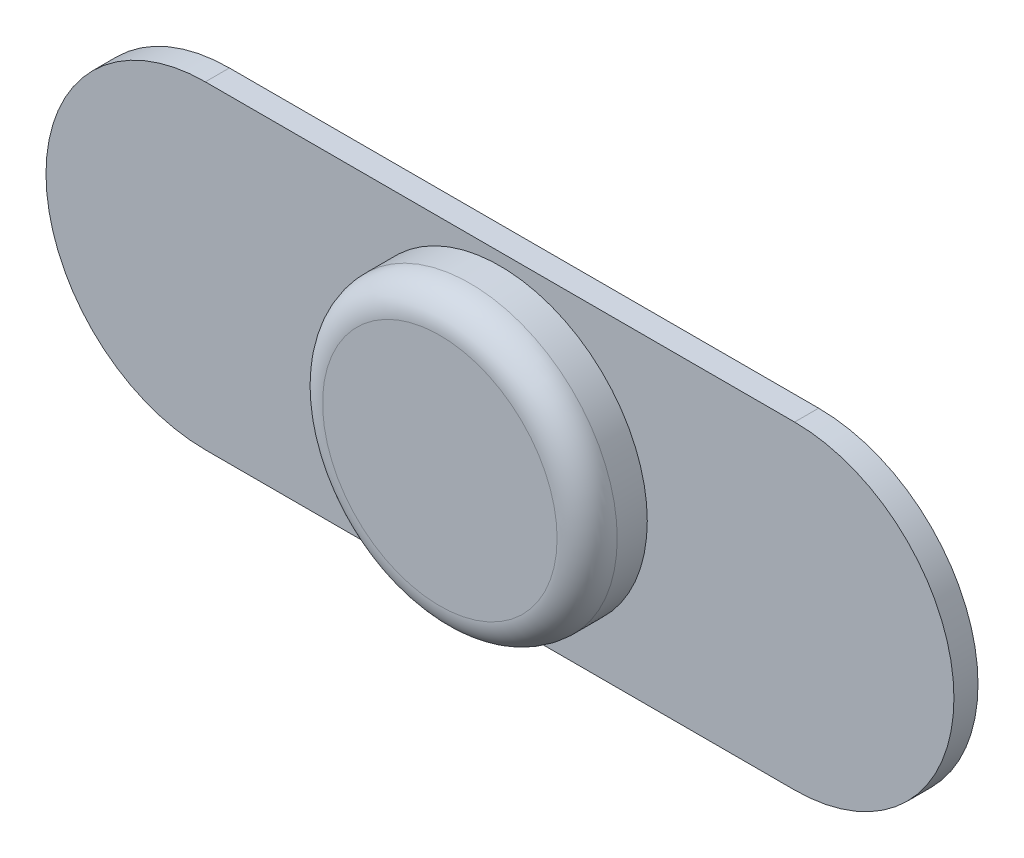
ISO-10303-21;
HEADER;
FILE_DESCRIPTION(('STEP AP214'),'2;1');
FILE_NAME('part.step','',(''),(''),'','','');
FILE_SCHEMA(('AUTOMOTIVE_DESIGN { 1 0 10303 214 1 1 1 1 }'));
ENDSEC;
DATA;
#1=APPLICATION_CONTEXT('core data for automotive mechanical design processes');
#2=APPLICATION_PROTOCOL_DEFINITION('international standard','automotive_design',2000,#1);
#3=PRODUCT_CONTEXT('',#1,'mechanical');
#4=PRODUCT('Part','Part','',(#3));
#5=PRODUCT_RELATED_PRODUCT_CATEGORY('part','',(#4));
#6=PRODUCT_DEFINITION_FORMATION('','',#4);
#7=PRODUCT_DEFINITION_CONTEXT('part definition',#1,'design');
#8=PRODUCT_DEFINITION('design','',#6,#7);
#9=PRODUCT_DEFINITION_SHAPE('','',#8);
#10=(LENGTH_UNIT() NAMED_UNIT(*) SI_UNIT(.MILLI.,.METRE.));
#11=(NAMED_UNIT(*) PLANE_ANGLE_UNIT() SI_UNIT($,.RADIAN.));
#12=(NAMED_UNIT(*) SI_UNIT($,.STERADIAN.) SOLID_ANGLE_UNIT());
#13=UNCERTAINTY_MEASURE_WITH_UNIT(LENGTH_MEASURE(1.E-05),#10,'distance_accuracy_value','');
#14=(GEOMETRIC_REPRESENTATION_CONTEXT(3) GLOBAL_UNCERTAINTY_ASSIGNED_CONTEXT((#13)) GLOBAL_UNIT_ASSIGNED_CONTEXT((#10,
#11,#12)) REPRESENTATION_CONTEXT('',''));
#15=CARTESIAN_POINT('',(0.,0.,0.));
#16=DIRECTION('',(0.,0.,1.));
#17=DIRECTION('',(1.,0.,0.));
#18=AXIS2_PLACEMENT_3D('',#15,#16,#17);
#19=CARTESIAN_POINT('',(0.,0.,1.));
#20=DIRECTION('',(0.,0.,-1.));
#21=DIRECTION('',(-1.,0.,0.));
#22=AXIS2_PLACEMENT_3D('',#19,#20,#21);
#23=CYLINDRICAL_SURFACE('',#22,2.45);
#24=CARTESIAN_POINT('',(0.,0.,0.5));
#25=DIRECTION('',(0.,0.,1.));
#26=DIRECTION('',(1.,0.,0.));
#27=AXIS2_PLACEMENT_3D('',#24,#25,#26);
#28=CIRCLE('',#27,2.45);
#29=CARTESIAN_POINT('',(2.45,0.,0.5));
#30=VERTEX_POINT('',#29);
#31=EDGE_CURVE('E11',#30,#30,#28,.F.);
#32=ORIENTED_EDGE('',*,*,#31,.T.);
#33=EDGE_LOOP('',(#32));
#34=FACE_BOUND('',#33,.T.);
#35=CARTESIAN_POINT('',(0.,0.,0.));
#36=DIRECTION('',(0.,0.,1.));
#37=DIRECTION('',(1.,0.,0.));
#38=AXIS2_PLACEMENT_3D('',#35,#36,#37);
#39=CIRCLE('',#38,2.45);
#40=CARTESIAN_POINT('',(2.45,0.,0.));
#41=VERTEX_POINT('',#40);
#42=EDGE_CURVE('E116',#41,#41,#39,.T.);
#43=ORIENTED_EDGE('',*,*,#42,.T.);
#44=EDGE_LOOP('',(#43));
#45=FACE_BOUND('',#44,.T.);
#46=ADVANCED_FACE('F39',(#34,#45),#23,.T.);
#47=CARTESIAN_POINT('',(0.,0.,1.));
#48=DIRECTION('',(0.,0.,1.));
#49=DIRECTION('',(1.,0.,0.));
#50=AXIS2_PLACEMENT_3D('',#47,#48,#49);
#51=PLANE('',#50);
#52=CARTESIAN_POINT('',(0.,0.,1.));
#53=DIRECTION('',(0.,0.,1.));
#54=DIRECTION('',(1.,0.,0.));
#55=AXIS2_PLACEMENT_3D('',#52,#53,#54);
#56=CIRCLE('',#55,1.95);
#57=CARTESIAN_POINT('',(1.95,0.,1.));
#58=VERTEX_POINT('',#57);
#59=EDGE_CURVE('E48',#58,#58,#56,.T.);
#60=ORIENTED_EDGE('',*,*,#59,.T.);
#61=EDGE_LOOP('',(#60));
#62=FACE_BOUND('',#61,.T.);
#63=ADVANCED_FACE('F121',(#62),#51,.T.);
#64=CARTESIAN_POINT('',(4.9,0.,-0.4));
#65=DIRECTION('',(0.,0.,1.));
#66=DIRECTION('',(1.,0.,0.));
#67=AXIS2_PLACEMENT_3D('',#64,#65,#66);
#68=CYLINDRICAL_SURFACE('',#67,2.65);
#69=CARTESIAN_POINT('',(4.9,0.,0.));
#70=DIRECTION('',(0.,0.,-1.));
#71=DIRECTION('',(-1.,0.,0.));
#72=AXIS2_PLACEMENT_3D('',#69,#70,#71);
#73=CIRCLE('',#72,2.65);
#74=CARTESIAN_POINT('',(4.9,2.65,0.));
#75=VERTEX_POINT('',#74);
#76=CARTESIAN_POINT('',(4.9,-2.65,0.));
#77=VERTEX_POINT('',#76);
#78=EDGE_CURVE('E107',#75,#77,#73,.T.);
#79=ORIENTED_EDGE('',*,*,#78,.T.);
#80=DIRECTION('',(0.,0.,1.));
#81=VECTOR('',#80,1.);
#82=CARTESIAN_POINT('',(4.9,-2.65,-0.4));
#83=LINE('',#82,#81);
#84=CARTESIAN_POINT('',(4.9,-2.65,-0.4));
#85=VERTEX_POINT('',#84);
#86=EDGE_CURVE('E98',#85,#77,#83,.T.);
#87=ORIENTED_EDGE('',*,*,#86,.F.);
#88=CARTESIAN_POINT('',(4.9,0.,-0.4));
#89=DIRECTION('',(0.,0.,-1.));
#90=DIRECTION('',(-1.,0.,0.));
#91=AXIS2_PLACEMENT_3D('',#88,#89,#90);
#92=CIRCLE('',#91,2.65);
#93=CARTESIAN_POINT('',(4.9,2.65,-0.4));
#94=VERTEX_POINT('',#93);
#95=EDGE_CURVE('E92',#94,#85,#92,.T.);
#96=ORIENTED_EDGE('',*,*,#95,.F.);
#97=DIRECTION('',(0.,0.,1.));
#98=VECTOR('',#97,1.);
#99=CARTESIAN_POINT('',(4.9,2.65,-0.4));
#100=LINE('',#99,#98);
#101=EDGE_CURVE('E103',#94,#75,#100,.T.);
#102=ORIENTED_EDGE('',*,*,#101,.T.);
#103=EDGE_LOOP('',(#79,#87,#96,#102));
#104=FACE_BOUND('',#103,.T.);
#105=ADVANCED_FACE('F137',(#104),#68,.T.);
#106=CARTESIAN_POINT('',(4.9,-2.65,-0.4));
#107=DIRECTION('',(0.,1.,0.));
#108=DIRECTION('',(-1.,0.,0.));
#109=AXIS2_PLACEMENT_3D('',#106,#107,#108);
#110=PLANE('',#109);
#111=DIRECTION('',(-1.,0.,0.));
#112=VECTOR('',#111,1.);
#113=CARTESIAN_POINT('',(4.9,-2.65,0.));
#114=LINE('',#113,#112);
#115=CARTESIAN_POINT('',(-4.9,-2.65,0.));
#116=VERTEX_POINT('',#115);
#117=EDGE_CURVE('E97',#77,#116,#114,.T.);
#118=ORIENTED_EDGE('',*,*,#117,.T.);
#119=DIRECTION('',(0.,0.,1.));
#120=VECTOR('',#119,1.);
#121=CARTESIAN_POINT('',(-4.9,-2.65,-0.4));
#122=LINE('',#121,#120);
#123=CARTESIAN_POINT('',(-4.9,-2.65,-0.4));
#124=VERTEX_POINT('',#123);
#125=EDGE_CURVE('E95',#124,#116,#122,.T.);
#126=ORIENTED_EDGE('',*,*,#125,.F.);
#127=DIRECTION('',(-1.,0.,0.));
#128=VECTOR('',#127,1.);
#129=CARTESIAN_POINT('',(4.9,-2.65,-0.4));
#130=LINE('',#129,#128);
#131=EDGE_CURVE('E87',#85,#124,#130,.T.);
#132=ORIENTED_EDGE('',*,*,#131,.F.);
#133=ORIENTED_EDGE('',*,*,#86,.T.);
#134=EDGE_LOOP('',(#118,#126,#132,#133));
#135=FACE_BOUND('',#134,.T.);
#136=ADVANCED_FACE('F96',(#135),#110,.F.);
#137=CARTESIAN_POINT('',(-4.9,0.,-0.4));
#138=DIRECTION('',(0.,0.,1.));
#139=DIRECTION('',(1.,0.,0.));
#140=AXIS2_PLACEMENT_3D('',#137,#138,#139);
#141=CYLINDRICAL_SURFACE('',#140,2.65);
#142=CARTESIAN_POINT('',(-4.9,0.,0.));
#143=DIRECTION('',(0.,0.,-1.));
#144=DIRECTION('',(-1.,0.,0.));
#145=AXIS2_PLACEMENT_3D('',#142,#143,#144);
#146=CIRCLE('',#145,2.65);
#147=CARTESIAN_POINT('',(-4.9,2.65,0.));
#148=VERTEX_POINT('',#147);
#149=EDGE_CURVE('E73',#116,#148,#146,.T.);
#150=ORIENTED_EDGE('',*,*,#149,.T.);
#151=DIRECTION('',(0.,0.,1.));
#152=VECTOR('',#151,1.);
#153=CARTESIAN_POINT('',(-4.9,2.65,-0.4));
#154=LINE('',#153,#152);
#155=CARTESIAN_POINT('',(-4.9,2.65,-0.4));
#156=VERTEX_POINT('',#155);
#157=EDGE_CURVE('E99',#156,#148,#154,.T.);
#158=ORIENTED_EDGE('',*,*,#157,.F.);
#159=CARTESIAN_POINT('',(-4.9,0.,-0.4));
#160=DIRECTION('',(0.,0.,-1.));
#161=DIRECTION('',(-1.,0.,0.));
#162=AXIS2_PLACEMENT_3D('',#159,#160,#161);
#163=CIRCLE('',#162,2.65);
#164=EDGE_CURVE('E90',#124,#156,#163,.T.);
#165=ORIENTED_EDGE('',*,*,#164,.F.);
#166=ORIENTED_EDGE('',*,*,#125,.T.);
#167=EDGE_LOOP('',(#150,#158,#165,#166));
#168=FACE_BOUND('',#167,.T.);
#169=ADVANCED_FACE('F101',(#168),#141,.T.);
#170=CARTESIAN_POINT('',(4.9,2.65,-0.4));
#171=DIRECTION('',(0.,-1.,0.));
#172=DIRECTION('',(1.,0.,0.));
#173=AXIS2_PLACEMENT_3D('',#170,#171,#172);
#174=PLANE('',#173);
#175=DIRECTION('',(1.,0.,0.));
#176=VECTOR('',#175,1.);
#177=CARTESIAN_POINT('',(4.9,2.65,0.));
#178=LINE('',#177,#176);
#179=EDGE_CURVE('E79',#148,#75,#178,.T.);
#180=ORIENTED_EDGE('',*,*,#179,.T.);
#181=ORIENTED_EDGE('',*,*,#101,.F.);
#182=DIRECTION('',(1.,0.,0.));
#183=VECTOR('',#182,1.);
#184=CARTESIAN_POINT('',(4.9,2.65,-0.4));
#185=LINE('',#184,#183);
#186=EDGE_CURVE('E56',#156,#94,#185,.T.);
#187=ORIENTED_EDGE('',*,*,#186,.F.);
#188=ORIENTED_EDGE('',*,*,#157,.T.);
#189=EDGE_LOOP('',(#180,#181,#187,#188));
#190=FACE_BOUND('',#189,.T.);
#191=ADVANCED_FACE('F148',(#190),#174,.F.);
#192=CARTESIAN_POINT('',(4.9,0.,-0.4));
#193=DIRECTION('',(0.,0.,-1.));
#194=DIRECTION('',(-1.,0.,0.));
#195=AXIS2_PLACEMENT_3D('',#192,#193,#194);
#196=PLANE('',#195);
#197=ORIENTED_EDGE('',*,*,#95,.T.);
#198=ORIENTED_EDGE('',*,*,#131,.T.);
#199=ORIENTED_EDGE('',*,*,#164,.T.);
#200=ORIENTED_EDGE('',*,*,#186,.T.);
#201=EDGE_LOOP('',(#197,#198,#199,#200));
#202=FACE_BOUND('',#201,.T.);
#203=ADVANCED_FACE('F88',(#202),#196,.T.);
#204=CARTESIAN_POINT('',(4.9,0.,0.));
#205=DIRECTION('',(0.,0.,-1.));
#206=DIRECTION('',(-1.,0.,0.));
#207=AXIS2_PLACEMENT_3D('',#204,#205,#206);
#208=PLANE('',#207);
#209=ORIENTED_EDGE('',*,*,#42,.F.);
#210=EDGE_LOOP('',(#209));
#211=FACE_BOUND('',#210,.T.);
#212=ORIENTED_EDGE('',*,*,#78,.F.);
#213=ORIENTED_EDGE('',*,*,#179,.F.);
#214=ORIENTED_EDGE('',*,*,#149,.F.);
#215=ORIENTED_EDGE('',*,*,#117,.F.);
#216=EDGE_LOOP('',(#212,#213,#214,#215));
#217=FACE_BOUND('',#216,.T.);
#218=ADVANCED_FACE('F124',(#211,#217),#208,.F.);
#219=CARTESIAN_POINT('',(0.,0.,0.5));
#220=DIRECTION('',(0.,0.,1.));
#221=DIRECTION('',(1.,0.,0.));
#222=AXIS2_PLACEMENT_3D('',#219,#220,#221);
#223=TOROIDAL_SURFACE('',#222,1.95,0.5);
#224=ORIENTED_EDGE('',*,*,#31,.F.);
#225=EDGE_LOOP('',(#224));
#226=FACE_BOUND('',#225,.T.);
#227=ORIENTED_EDGE('',*,*,#59,.F.);
#228=EDGE_LOOP('',(#227));
#229=FACE_BOUND('',#228,.T.);
#230=ADVANCED_FACE('F41',(#226,#229),#223,.T.);
#231=CLOSED_SHELL('',(#46,#63,#105,#136,#169,#191,#203,#218,#230));
#232=MANIFOLD_SOLID_BREP('B2',#231);
#233=ADVANCED_BREP_SHAPE_REPRESENTATION('',(#18,#232),#14);
#234=SHAPE_DEFINITION_REPRESENTATION(#9,#233);
ENDSEC;
END-ISO-10303-21;
